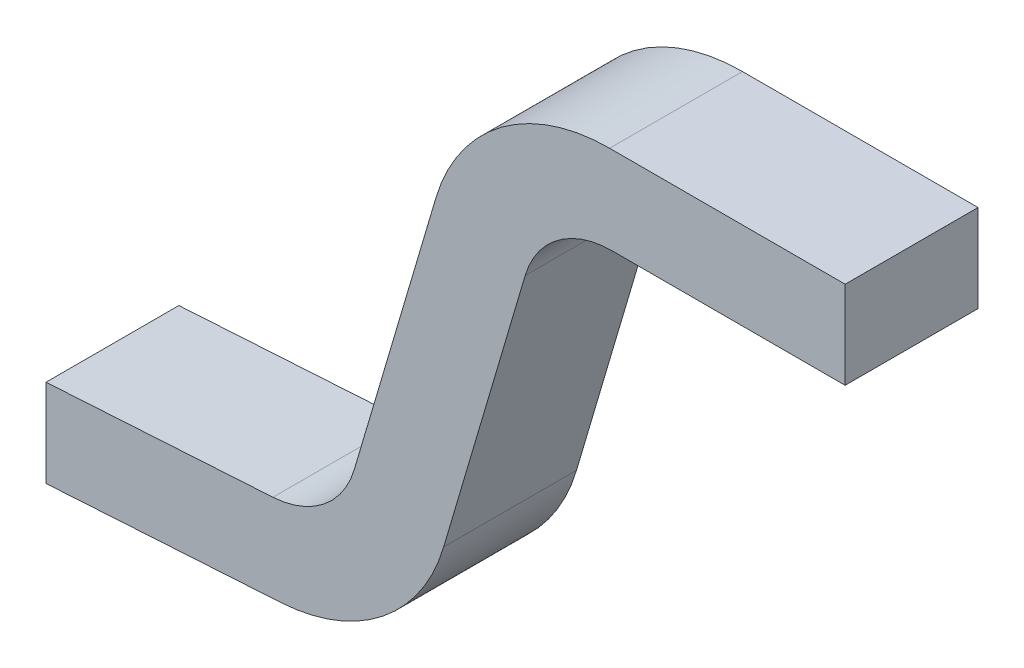
ISO-10303-21;
HEADER;
FILE_DESCRIPTION(('STEP AP214'),'2;1');
FILE_NAME('part.step','',(''),(''),'','','');
FILE_SCHEMA(('AUTOMOTIVE_DESIGN { 1 0 10303 214 1 1 1 1 }'));
ENDSEC;
DATA;
#1=APPLICATION_CONTEXT('core data for automotive mechanical design processes');
#2=APPLICATION_PROTOCOL_DEFINITION('international standard','automotive_design',2000,#1);
#3=PRODUCT_CONTEXT('',#1,'mechanical');
#4=PRODUCT('Part','Part','',(#3));
#5=PRODUCT_RELATED_PRODUCT_CATEGORY('part','',(#4));
#6=PRODUCT_DEFINITION_FORMATION('','',#4);
#7=PRODUCT_DEFINITION_CONTEXT('part definition',#1,'design');
#8=PRODUCT_DEFINITION('design','',#6,#7);
#9=PRODUCT_DEFINITION_SHAPE('','',#8);
#10=(LENGTH_UNIT() NAMED_UNIT(*) SI_UNIT(.MILLI.,.METRE.));
#11=(NAMED_UNIT(*) PLANE_ANGLE_UNIT() SI_UNIT($,.RADIAN.));
#12=(NAMED_UNIT(*) SI_UNIT($,.STERADIAN.) SOLID_ANGLE_UNIT());
#13=UNCERTAINTY_MEASURE_WITH_UNIT(LENGTH_MEASURE(1.E-05),#10,'distance_accuracy_value','');
#14=(GEOMETRIC_REPRESENTATION_CONTEXT(3) GLOBAL_UNCERTAINTY_ASSIGNED_CONTEXT((#13)) GLOBAL_UNIT_ASSIGNED_CONTEXT((#10,
#11,#12)) REPRESENTATION_CONTEXT('',''));
#15=CARTESIAN_POINT('',(0.,0.,0.));
#16=DIRECTION('',(0.,0.,1.));
#17=DIRECTION('',(1.,0.,0.));
#18=AXIS2_PLACEMENT_3D('',#15,#16,#17);
#19=CARTESIAN_POINT('',(0.,0.802499999999999,0.5));
#20=DIRECTION('',(0.,-1.,0.));
#21=DIRECTION('',(1.,0.,0.));
#22=AXIS2_PLACEMENT_3D('',#19,#20,#21);
#23=PLANE('',#22);
#24=DIRECTION('',(0.,0.,1.));
#25=VECTOR('',#24,1.);
#26=CARTESIAN_POINT('',(-6.676658254168,0.802499999999998,-3.090259808256));
#27=LINE('',#26,#25);
#28=CARTESIAN_POINT('',(-6.676658254168,0.8025,0.39));
#29=VERTEX_POINT('',#28);
#30=CARTESIAN_POINT('',(-6.676658254168,0.802499999999996,0.61));
#31=VERTEX_POINT('',#30);
#32=EDGE_CURVE('E11',#29,#31,#27,.T.);
#33=ORIENTED_EDGE('',*,*,#32,.T.);
#34=DIRECTION('',(-1.,0.,0.));
#35=VECTOR('',#34,1.);
#36=CARTESIAN_POINT('',(0.,0.802499999999999,0.61));
#37=LINE('',#36,#35);
#38=CARTESIAN_POINT('',(-7.062676694145,0.802499999999996,0.61));
#39=VERTEX_POINT('',#38);
#40=EDGE_CURVE('E24',#31,#39,#37,.T.);
#41=ORIENTED_EDGE('',*,*,#40,.T.);
#42=DIRECTION('',(0.,0.,-1.));
#43=VECTOR('',#42,1.);
#44=CARTESIAN_POINT('',(-7.062676694145,0.802499999999996,0.5));
#45=LINE('',#44,#43);
#46=CARTESIAN_POINT('',(-7.062676694145,0.802499999999996,0.39));
#47=VERTEX_POINT('',#46);
#48=EDGE_CURVE('E203',#39,#47,#45,.T.);
#49=ORIENTED_EDGE('',*,*,#48,.T.);
#50=DIRECTION('',(-1.,0.,0.));
#51=VECTOR('',#50,1.);
#52=CARTESIAN_POINT('',(5.991418106262,0.8025,0.39));
#53=LINE('',#52,#51);
#54=EDGE_CURVE('E200',#29,#47,#53,.T.);
#55=ORIENTED_EDGE('',*,*,#54,.F.);
#56=EDGE_LOOP('',(#33,#41,#49,#55));
#57=FACE_BOUND('',#56,.T.);
#58=ADVANCED_FACE('F17',(#57),#23,.T.);
#59=CARTESIAN_POINT('',(-7.066642234143,0.647499999999996,0.5));
#60=DIRECTION('',(0.,0.,-1.));
#61=DIRECTION('',(-0.598564686690895,0.801074475842684,0.));
#62=AXIS2_PLACEMENT_3D('',#59,#60,#61);
#63=CYLINDRICAL_SURFACE('',#62,0.3);
#64=CARTESIAN_POINT('',(-7.066642234143,0.647499999999996,0.61));
#65=DIRECTION('',(0.,0.,1.));
#66=DIRECTION('',(-0.598564686690895,0.801074475842684,0.));
#67=AXIS2_PLACEMENT_3D('',#64,#65,#66);
#68=CIRCLE('',#67,0.3);
#69=CARTESIAN_POINT('',(-7.066642234143,0.947499999999996,0.61));
#70=VERTEX_POINT('',#69);
#71=CARTESIAN_POINT('',(-7.354339169732,0.732532189507976,0.61));
#72=VERTEX_POINT('',#71);
#73=EDGE_CURVE('E198',#70,#72,#68,.T.);
#74=ORIENTED_EDGE('',*,*,#73,.F.);
#75=DIRECTION('',(0.,0.,1.));
#76=VECTOR('',#75,1.);
#77=CARTESIAN_POINT('',(-7.066642234143,0.947499999999996,0.5));
#78=LINE('',#77,#76);
#79=CARTESIAN_POINT('',(-7.066642234143,0.947499999999996,0.39));
#80=VERTEX_POINT('',#79);
#81=EDGE_CURVE('E195',#80,#70,#78,.T.);
#82=ORIENTED_EDGE('',*,*,#81,.F.);
#83=CARTESIAN_POINT('',(-7.066642234143,0.647499999999996,0.39));
#84=DIRECTION('',(0.,0.,-1.));
#85=DIRECTION('',(-0.598564686690895,0.801074475842684,0.));
#86=AXIS2_PLACEMENT_3D('',#83,#84,#85);
#87=CIRCLE('',#86,0.3);
#88=CARTESIAN_POINT('',(-7.354339169732,0.732532189507976,0.39));
#89=VERTEX_POINT('',#88);
#90=EDGE_CURVE('E192',#89,#80,#87,.T.);
#91=ORIENTED_EDGE('',*,*,#90,.F.);
#92=DIRECTION('',(0.,0.,-1.));
#93=VECTOR('',#92,1.);
#94=CARTESIAN_POINT('',(-7.354339169732,0.732532189507976,0.5));
#95=LINE('',#94,#93);
#96=EDGE_CURVE('E189',#72,#89,#95,.T.);
#97=ORIENTED_EDGE('',*,*,#96,.F.);
#98=EDGE_LOOP('',(#74,#82,#91,#97));
#99=FACE_BOUND('',#98,.T.);
#100=ADVANCED_FACE('F226',(#99),#63,.T.);
#101=CARTESIAN_POINT('',(-7.401119120947,0.0366291237209098,0.5));
#102=DIRECTION('',(-0.061048539534858,0.998134798421867,0.));
#103=DIRECTION('',(-0.998134798421867,-0.061048539534858,0.));
#104=AXIS2_PLACEMENT_3D('',#101,#102,#103);
#105=PLANE('',#104);
#106=DIRECTION('',(0.,0.,1.));
#107=VECTOR('',#106,1.);
#108=CARTESIAN_POINT('',(-7.610923331438,0.0237969484886628,0.5));
#109=LINE('',#108,#107);
#110=CARTESIAN_POINT('',(-7.610923331438,0.0237969484886628,0.39));
#111=VERTEX_POINT('',#110);
#112=CARTESIAN_POINT('',(-7.610923331438,0.0237969484886628,0.61));
#113=VERTEX_POINT('',#112);
#114=EDGE_CURVE('E187',#111,#113,#109,.T.);
#115=ORIENTED_EDGE('',*,*,#114,.T.);
#116=DIRECTION('',(-0.998134798421867,-0.061048539534858,0.));
#117=VECTOR('',#116,1.);
#118=CARTESIAN_POINT('',(-7.401119120947,0.0366291237209098,0.61));
#119=LINE('',#118,#117);
#120=CARTESIAN_POINT('',(-8.,0.,0.61));
#121=VERTEX_POINT('',#120);
#122=EDGE_CURVE('E185',#113,#121,#119,.T.);
#123=ORIENTED_EDGE('',*,*,#122,.T.);
#124=DIRECTION('',(0.,0.,-1.));
#125=VECTOR('',#124,1.);
#126=CARTESIAN_POINT('',(-8.,0.,0.5));
#127=LINE('',#126,#125);
#128=CARTESIAN_POINT('',(-8.,0.,0.39));
#129=VERTEX_POINT('',#128);
#130=EDGE_CURVE('E183',#121,#129,#127,.T.);
#131=ORIENTED_EDGE('',*,*,#130,.T.);
#132=DIRECTION('',(0.998134798421867,0.061048539534858,0.));
#133=VECTOR('',#132,1.);
#134=CARTESIAN_POINT('',(-7.401119120947,0.0366291237209098,0.39));
#135=LINE('',#134,#133);
#136=EDGE_CURVE('E128',#129,#111,#135,.T.);
#137=ORIENTED_EDGE('',*,*,#136,.T.);
#138=EDGE_LOOP('',(#115,#123,#131,#137));
#139=FACE_BOUND('',#138,.T.);
#140=ADVANCED_FACE('F235',(#139),#105,.F.);
#141=CARTESIAN_POINT('',(-7.629237893299,0.323237388015223,0.5));
#142=DIRECTION('',(0.,0.,1.));
#143=DIRECTION('',(0.622749134098774,-0.782421571775234,0.));
#144=AXIS2_PLACEMENT_3D('',#141,#142,#143);
#145=CYLINDRICAL_SURFACE('',#144,0.3);
#146=CARTESIAN_POINT('',(-7.629237893299,0.323237388015223,0.39));
#147=DIRECTION('',(0.,0.,-1.));
#148=DIRECTION('',(0.622749134098774,-0.782421571775234,0.));
#149=AXIS2_PLACEMENT_3D('',#146,#147,#148);
#150=CIRCLE('',#149,0.3);
#151=CARTESIAN_POINT('',(-7.341540957709,0.238205198507244,0.39));
#152=VERTEX_POINT('',#151);
#153=EDGE_CURVE('E180',#152,#111,#150,.T.);
#154=ORIENTED_EDGE('',*,*,#153,.F.);
#155=DIRECTION('',(0.,0.,-1.));
#156=VECTOR('',#155,1.);
#157=CARTESIAN_POINT('',(-7.341540957709,0.238205198507244,0.5));
#158=LINE('',#157,#156);
#159=CARTESIAN_POINT('',(-7.341540957709,0.238205198507244,0.61));
#160=VERTEX_POINT('',#159);
#161=EDGE_CURVE('E177',#160,#152,#158,.T.);
#162=ORIENTED_EDGE('',*,*,#161,.F.);
#163=CARTESIAN_POINT('',(-7.629237893299,0.323237388015223,0.61));
#164=DIRECTION('',(0.,0.,1.));
#165=DIRECTION('',(0.622749134098774,-0.782421571775234,0.));
#166=AXIS2_PLACEMENT_3D('',#163,#164,#165);
#167=CIRCLE('',#166,0.3);
#168=EDGE_CURVE('E174',#113,#160,#167,.T.);
#169=ORIENTED_EDGE('',*,*,#168,.F.);
#170=ORIENTED_EDGE('',*,*,#114,.F.);
#171=EDGE_LOOP('',(#154,#162,#169,#170));
#172=FACE_BOUND('',#171,.T.);
#173=ADVANCED_FACE('F234',(#172),#145,.T.);
#174=CARTESIAN_POINT('',(-7.174757038372,0.802499999999996,0.5));
#175=DIRECTION('',(-0.958989785297698,0.283440631693263,0.));
#176=DIRECTION('',(-0.283440631693263,-0.958989785297698,0.));
#177=AXIS2_PLACEMENT_3D('',#174,#175,#176);
#178=PLANE('',#177);
#179=DIRECTION('',(0.,0.,1.));
#180=VECTOR('',#179,1.);
#181=CARTESIAN_POINT('',(-7.20652516194,0.695016094753986,0.5));
#182=LINE('',#181,#180);
#183=CARTESIAN_POINT('',(-7.20652516194,0.695016094753986,0.39));
#184=VERTEX_POINT('',#183);
#185=CARTESIAN_POINT('',(-7.20652516194,0.695016094753986,0.61));
#186=VERTEX_POINT('',#185);
#187=EDGE_CURVE('E172',#184,#186,#182,.T.);
#188=ORIENTED_EDGE('',*,*,#187,.T.);
#189=DIRECTION('',(-0.283440631693263,-0.958989785297698,0.));
#190=VECTOR('',#189,1.);
#191=CARTESIAN_POINT('',(-7.174757038372,0.802499999999996,0.61));
#192=LINE('',#191,#190);
#193=EDGE_CURVE('E169',#186,#160,#192,.T.);
#194=ORIENTED_EDGE('',*,*,#193,.T.);
#195=ORIENTED_EDGE('',*,*,#161,.T.);
#196=DIRECTION('',(0.283440631693263,0.958989785297698,0.));
#197=VECTOR('',#196,1.);
#198=CARTESIAN_POINT('',(-7.174757038372,0.802499999999996,0.39));
#199=LINE('',#198,#197);
#200=EDGE_CURVE('E166',#152,#184,#199,.T.);
#201=ORIENTED_EDGE('',*,*,#200,.T.);
#202=EDGE_LOOP('',(#188,#194,#195,#201));
#203=FACE_BOUND('',#202,.T.);
#204=ADVANCED_FACE('F215',(#203),#178,.F.);
#205=CARTESIAN_POINT('',(-7.062676694145,0.652499999999996,0.5));
#206=DIRECTION('',(0.,0.,-1.));
#207=DIRECTION('',(-0.598564686690893,0.801074475842686,0.));
#208=AXIS2_PLACEMENT_3D('',#205,#206,#207);
#209=CYLINDRICAL_SURFACE('',#208,0.15);
#210=CARTESIAN_POINT('',(-7.062676694145,0.652499999999996,0.39));
#211=DIRECTION('',(0.,0.,1.));
#212=DIRECTION('',(-0.598564686690893,0.801074475842686,0.));
#213=AXIS2_PLACEMENT_3D('',#210,#211,#212);
#214=CIRCLE('',#213,0.15);
#215=EDGE_CURVE('E163',#47,#184,#214,.T.);
#216=ORIENTED_EDGE('',*,*,#215,.F.);
#217=ORIENTED_EDGE('',*,*,#48,.F.);
#218=CARTESIAN_POINT('',(-7.062676694145,0.652499999999996,0.61));
#219=DIRECTION('',(0.,0.,-1.));
#220=DIRECTION('',(-0.598564686690893,0.801074475842686,0.));
#221=AXIS2_PLACEMENT_3D('',#218,#219,#220);
#222=CIRCLE('',#221,0.15);
#223=EDGE_CURVE('E160',#186,#39,#222,.T.);
#224=ORIENTED_EDGE('',*,*,#223,.F.);
#225=ORIENTED_EDGE('',*,*,#187,.F.);
#226=EDGE_LOOP('',(#216,#217,#224,#225));
#227=FACE_BOUND('',#226,.T.);
#228=ADVANCED_FACE('F209',(#227),#209,.F.);
#229=CARTESIAN_POINT('',(-7.51921986564,0.174676732356892,0.5));
#230=DIRECTION('',(0.958989785297697,-0.283440631693265,0.));
#231=DIRECTION('',(0.283440631693265,0.958989785297697,0.));
#232=AXIS2_PLACEMENT_3D('',#229,#230,#231);
#233=PLANE('',#232);
#234=DIRECTION('',(0.,0.,1.));
#235=VECTOR('',#234,1.);
#236=CARTESIAN_POINT('',(-7.489430784021,0.275464769750059,0.5));
#237=LINE('',#236,#235);
#238=CARTESIAN_POINT('',(-7.489430784021,0.275464769750059,0.39));
#239=VERTEX_POINT('',#238);
#240=CARTESIAN_POINT('',(-7.489430784021,0.275464769750059,0.61));
#241=VERTEX_POINT('',#240);
#242=EDGE_CURVE('E158',#239,#241,#237,.T.);
#243=ORIENTED_EDGE('',*,*,#242,.T.);
#244=DIRECTION('',(0.283440631693265,0.958989785297697,0.));
#245=VECTOR('',#244,1.);
#246=CARTESIAN_POINT('',(-7.51921986564,0.174676732356892,0.61));
#247=LINE('',#246,#245);
#248=EDGE_CURVE('E155',#241,#72,#247,.T.);
#249=ORIENTED_EDGE('',*,*,#248,.T.);
#250=ORIENTED_EDGE('',*,*,#96,.T.);
#251=DIRECTION('',(-0.283440631693265,-0.958989785297697,0.));
#252=VECTOR('',#251,1.);
#253=CARTESIAN_POINT('',(-7.51921986564,0.174676732356892,0.39));
#254=LINE('',#253,#252);
#255=EDGE_CURVE('E152',#89,#239,#254,.T.);
#256=ORIENTED_EDGE('',*,*,#255,.T.);
#257=EDGE_LOOP('',(#243,#249,#250,#256));
#258=FACE_BOUND('',#257,.T.);
#259=ADVANCED_FACE('F229',(#258),#233,.F.);
#260=CARTESIAN_POINT('',(-7.633279251816,0.317980864504048,0.5));
#261=DIRECTION('',(0.,0.,-1.));
#262=DIRECTION('',(0.622749134098776,-0.782421571775232,0.));
#263=AXIS2_PLACEMENT_3D('',#260,#261,#262);
#264=CYLINDRICAL_SURFACE('',#263,0.15);
#265=CARTESIAN_POINT('',(-7.633279251816,0.317980864504048,0.39));
#266=DIRECTION('',(0.,0.,1.));
#267=DIRECTION('',(0.622749134098776,-0.782421571775232,0.));
#268=AXIS2_PLACEMENT_3D('',#265,#266,#267);
#269=CIRCLE('',#268,0.15);
#270=CARTESIAN_POINT('',(-7.624121970886,0.168260644740768,0.39));
#271=VERTEX_POINT('',#270);
#272=EDGE_CURVE('E150',#271,#239,#269,.T.);
#273=ORIENTED_EDGE('',*,*,#272,.F.);
#274=DIRECTION('',(0.,0.,-1.));
#275=VECTOR('',#274,1.);
#276=CARTESIAN_POINT('',(-7.624121970886,0.168260644740768,0.5));
#277=LINE('',#276,#275);
#278=CARTESIAN_POINT('',(-7.624121970886,0.168260644740768,0.61));
#279=VERTEX_POINT('',#278);
#280=EDGE_CURVE('E119',#279,#271,#277,.T.);
#281=ORIENTED_EDGE('',*,*,#280,.F.);
#282=CARTESIAN_POINT('',(-7.633279251816,0.317980864504048,0.61));
#283=DIRECTION('',(0.,0.,-1.));
#284=DIRECTION('',(0.622749134098776,-0.782421571775232,0.));
#285=AXIS2_PLACEMENT_3D('',#282,#283,#284);
#286=CIRCLE('',#285,0.15);
#287=EDGE_CURVE('E147',#241,#279,#286,.T.);
#288=ORIENTED_EDGE('',*,*,#287,.F.);
#289=ORIENTED_EDGE('',*,*,#242,.F.);
#290=EDGE_LOOP('',(#273,#281,#288,#289));
#291=FACE_BOUND('',#290,.T.);
#292=ADVANCED_FACE('F231',(#291),#264,.F.);
#293=CARTESIAN_POINT('',(7.290802922596,0.9475,0.5));
#294=DIRECTION('',(0.,1.,0.));
#295=DIRECTION('',(-1.,0.,0.));
#296=AXIS2_PLACEMENT_3D('',#293,#294,#295);
#297=PLANE('',#296);
#298=DIRECTION('',(0.,0.,-1.));
#299=VECTOR('',#298,1.);
#300=CARTESIAN_POINT('',(-6.676658254168,0.9475,-3.090259808256));
#301=LINE('',#300,#299);
#302=CARTESIAN_POINT('',(-6.676658254168,0.9475,0.610000000000001));
#303=VERTEX_POINT('',#302);
#304=CARTESIAN_POINT('',(-6.676658254168,0.947499999999996,0.39));
#305=VERTEX_POINT('',#304);
#306=EDGE_CURVE('E145',#303,#305,#301,.T.);
#307=ORIENTED_EDGE('',*,*,#306,.T.);
#308=DIRECTION('',(-1.,0.,0.));
#309=VECTOR('',#308,1.);
#310=CARTESIAN_POINT('',(-5.991418106262,0.947499999999996,0.39));
#311=LINE('',#310,#309);
#312=EDGE_CURVE('E142',#305,#80,#311,.T.);
#313=ORIENTED_EDGE('',*,*,#312,.T.);
#314=ORIENTED_EDGE('',*,*,#81,.T.);
#315=DIRECTION('',(-1.,0.,0.));
#316=VECTOR('',#315,1.);
#317=CARTESIAN_POINT('',(7.290802922596,0.9475,0.610000000000001));
#318=LINE('',#317,#316);
#319=EDGE_CURVE('E139',#303,#70,#318,.T.);
#320=ORIENTED_EDGE('',*,*,#319,.F.);
#321=EDGE_LOOP('',(#307,#313,#314,#320));
#322=FACE_BOUND('',#321,.T.);
#323=ADVANCED_FACE('F221',(#322),#297,.T.);
#324=CARTESIAN_POINT('',(7.443119144837,0.124924841185095,0.610000000000001));
#325=DIRECTION('',(0.,0.,1.));
#326=DIRECTION('',(1.,0.,0.));
#327=AXIS2_PLACEMENT_3D('',#324,#325,#326);
#328=PLANE('',#327);
#329=DIRECTION('',(0.,-1.,0.));
#330=VECTOR('',#329,1.);
#331=CARTESIAN_POINT('',(-8.,0.201593494118527,0.610000000000001));
#332=LINE('',#331,#330);
#333=CARTESIAN_POINT('',(-8.,0.145270959623141,0.61));
#334=VERTEX_POINT('',#333);
#335=EDGE_CURVE('E109',#334,#121,#332,.T.);
#336=ORIENTED_EDGE('',*,*,#335,.T.);
#337=ORIENTED_EDGE('',*,*,#122,.F.);
#338=ORIENTED_EDGE('',*,*,#168,.T.);
#339=ORIENTED_EDGE('',*,*,#193,.F.);
#340=ORIENTED_EDGE('',*,*,#223,.T.);
#341=ORIENTED_EDGE('',*,*,#40,.F.);
#342=DIRECTION('',(0.,1.,0.));
#343=VECTOR('',#342,1.);
#344=CARTESIAN_POINT('',(-6.676658254168,0.536212420592548,0.610000000000001));
#345=LINE('',#344,#343);
#346=EDGE_CURVE('E135',#31,#303,#345,.T.);
#347=ORIENTED_EDGE('',*,*,#346,.T.);
#348=ORIENTED_EDGE('',*,*,#319,.T.);
#349=ORIENTED_EDGE('',*,*,#73,.T.);
#350=ORIENTED_EDGE('',*,*,#248,.F.);
#351=ORIENTED_EDGE('',*,*,#287,.T.);
#352=DIRECTION('',(0.998134798421867,0.061048539534858,0.));
#353=VECTOR('',#352,1.);
#354=CARTESIAN_POINT('',(-8.008852038233,0.144729545771166,0.61));
#355=LINE('',#354,#353);
#356=EDGE_CURVE('E133',#334,#279,#355,.T.);
#357=ORIENTED_EDGE('',*,*,#356,.F.);
#358=EDGE_LOOP('',(#336,#337,#338,#339,#340,#341,#347,#348,#349,#350,#351,#357));
#359=FACE_BOUND('',#358,.T.);
#360=ADVANCED_FACE('F211',(#359),#328,.T.);
#361=CARTESIAN_POINT('',(-6.676658254168,0.9475,-6.680519616513));
#362=DIRECTION('',(-1.,0.,0.));
#363=DIRECTION('',(0.,0.,1.));
#364=AXIS2_PLACEMENT_3D('',#361,#362,#363);
#365=PLANE('',#364);
#366=DIRECTION('',(0.,-1.,0.));
#367=VECTOR('',#366,1.);
#368=CARTESIAN_POINT('',(-6.676658254168,0.536212420592548,0.39));
#369=LINE('',#368,#367);
#370=EDGE_CURVE('E113',#305,#29,#369,.T.);
#371=ORIENTED_EDGE('',*,*,#370,.F.);
#372=ORIENTED_EDGE('',*,*,#306,.F.);
#373=ORIENTED_EDGE('',*,*,#346,.F.);
#374=ORIENTED_EDGE('',*,*,#32,.F.);
#375=EDGE_LOOP('',(#371,#372,#373,#374));
#376=FACE_BOUND('',#375,.T.);
#377=ADVANCED_FACE('F218',(#376),#365,.F.);
#378=CARTESIAN_POINT('',(-7.51921986564,0.174676732356892,0.5));
#379=DIRECTION('',(0.061048539534858,-0.998134798421867,0.));
#380=DIRECTION('',(0.998134798421867,0.061048539534858,0.));
#381=AXIS2_PLACEMENT_3D('',#378,#379,#380);
#382=PLANE('',#381);
#383=DIRECTION('',(0.,0.,1.));
#384=VECTOR('',#383,1.);
#385=CARTESIAN_POINT('',(-8.,0.145270959623141,-2.805));
#386=LINE('',#385,#384);
#387=CARTESIAN_POINT('',(-8.,0.145270959623141,0.39));
#388=VERTEX_POINT('',#387);
#389=EDGE_CURVE('E102',#388,#334,#386,.T.);
#390=ORIENTED_EDGE('',*,*,#389,.T.);
#391=ORIENTED_EDGE('',*,*,#356,.T.);
#392=ORIENTED_EDGE('',*,*,#280,.T.);
#393=DIRECTION('',(-0.998134798421867,-0.061048539534858,0.));
#394=VECTOR('',#393,1.);
#395=CARTESIAN_POINT('',(-8.008852038233,0.144729545771166,0.39));
#396=LINE('',#395,#394);
#397=EDGE_CURVE('E114',#271,#388,#396,.T.);
#398=ORIENTED_EDGE('',*,*,#397,.T.);
#399=EDGE_LOOP('',(#390,#391,#392,#398));
#400=FACE_BOUND('',#399,.T.);
#401=ADVANCED_FACE('F117',(#400),#382,.F.);
#402=CARTESIAN_POINT('',(7.443119144837,0.124924841185095,0.39));
#403=DIRECTION('',(0.,0.,-1.));
#404=DIRECTION('',(-1.,0.,0.));
#405=AXIS2_PLACEMENT_3D('',#402,#403,#404);
#406=PLANE('',#405);
#407=DIRECTION('',(0.,1.,0.));
#408=VECTOR('',#407,1.);
#409=CARTESIAN_POINT('',(-8.,0.201593494118527,0.39));
#410=LINE('',#409,#408);
#411=EDGE_CURVE('E107',#129,#388,#410,.T.);
#412=ORIENTED_EDGE('',*,*,#411,.T.);
#413=ORIENTED_EDGE('',*,*,#397,.F.);
#414=ORIENTED_EDGE('',*,*,#272,.T.);
#415=ORIENTED_EDGE('',*,*,#255,.F.);
#416=ORIENTED_EDGE('',*,*,#90,.T.);
#417=ORIENTED_EDGE('',*,*,#312,.F.);
#418=ORIENTED_EDGE('',*,*,#370,.T.);
#419=ORIENTED_EDGE('',*,*,#54,.T.);
#420=ORIENTED_EDGE('',*,*,#215,.T.);
#421=ORIENTED_EDGE('',*,*,#200,.F.);
#422=ORIENTED_EDGE('',*,*,#153,.T.);
#423=ORIENTED_EDGE('',*,*,#136,.F.);
#424=EDGE_LOOP('',(#412,#413,#414,#415,#416,#417,#418,#419,#420,#421,#422,#423));
#425=FACE_BOUND('',#424,.T.);
#426=ADVANCED_FACE('F125',(#425),#406,.T.);
#427=CARTESIAN_POINT('',(-8.,0.27826214705197,-6.11));
#428=DIRECTION('',(1.,0.,0.));
#429=DIRECTION('',(0.,-1.,0.));
#430=AXIS2_PLACEMENT_3D('',#427,#428,#429);
#431=PLANE('',#430);
#432=ORIENTED_EDGE('',*,*,#411,.F.);
#433=ORIENTED_EDGE('',*,*,#130,.F.);
#434=ORIENTED_EDGE('',*,*,#335,.F.);
#435=ORIENTED_EDGE('',*,*,#389,.F.);
#436=EDGE_LOOP('',(#432,#433,#434,#435));
#437=FACE_BOUND('',#436,.T.);
#438=ADVANCED_FACE('F104',(#437),#431,.F.);
#439=CLOSED_SHELL('',(#58,#100,#140,#173,#204,#228,#259,#292,#323,#360,#377,#401,#426,#438));
#440=MANIFOLD_SOLID_BREP('B1',#439);
#441=ADVANCED_BREP_SHAPE_REPRESENTATION('',(#18,#440),#14);
#442=SHAPE_DEFINITION_REPRESENTATION(#9,#441);
ENDSEC;
END-ISO-10303-21;
